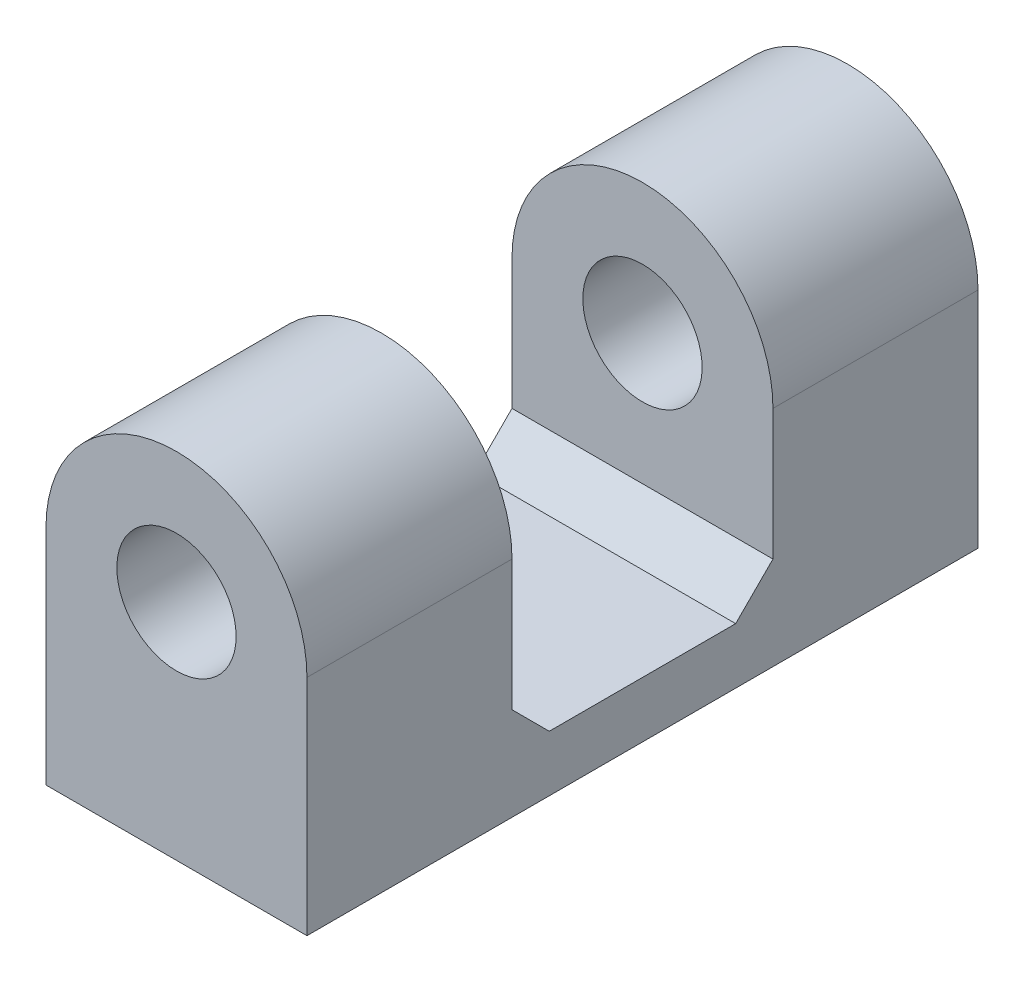
ISO-10303-21;
HEADER;
FILE_DESCRIPTION(('STEP AP214'),'2;1');
FILE_NAME('part.step','',(''),(''),'','','');
FILE_SCHEMA(('AUTOMOTIVE_DESIGN { 1 0 10303 214 1 1 1 1 }'));
ENDSEC;
DATA;
#1=APPLICATION_CONTEXT('core data for automotive mechanical design processes');
#2=APPLICATION_PROTOCOL_DEFINITION('international standard','automotive_design',2000,#1);
#3=PRODUCT_CONTEXT('',#1,'mechanical');
#4=PRODUCT('Part','Part','',(#3));
#5=PRODUCT_RELATED_PRODUCT_CATEGORY('part','',(#4));
#6=PRODUCT_DEFINITION_FORMATION('','',#4);
#7=PRODUCT_DEFINITION_CONTEXT('part definition',#1,'design');
#8=PRODUCT_DEFINITION('design','',#6,#7);
#9=PRODUCT_DEFINITION_SHAPE('','',#8);
#10=(LENGTH_UNIT() NAMED_UNIT(*) SI_UNIT(.MILLI.,.METRE.));
#11=(NAMED_UNIT(*) PLANE_ANGLE_UNIT() SI_UNIT($,.RADIAN.));
#12=(NAMED_UNIT(*) SI_UNIT($,.STERADIAN.) SOLID_ANGLE_UNIT());
#13=UNCERTAINTY_MEASURE_WITH_UNIT(LENGTH_MEASURE(1.E-05),#10,'distance_accuracy_value','');
#14=(GEOMETRIC_REPRESENTATION_CONTEXT(3) GLOBAL_UNCERTAINTY_ASSIGNED_CONTEXT((#13)) GLOBAL_UNIT_ASSIGNED_CONTEXT((#10,
#11,#12)) REPRESENTATION_CONTEXT('',''));
#15=CARTESIAN_POINT('',(0.,0.,0.));
#16=DIRECTION('',(0.,0.,1.));
#17=DIRECTION('',(1.,0.,0.));
#18=AXIS2_PLACEMENT_3D('',#15,#16,#17);
#19=CARTESIAN_POINT('',(0.,0.,18.));
#20=DIRECTION('',(0.,0.,-1.));
#21=DIRECTION('',(-1.,0.,0.));
#22=AXIS2_PLACEMENT_3D('',#19,#20,#21);
#23=CYLINDRICAL_SURFACE('',#22,3.5);
#24=DIRECTION('',(0.,0.,-1.));
#25=VECTOR('',#24,1.);
#26=CARTESIAN_POINT('',(-3.5,0.,18.));
#27=LINE('',#26,#25);
#28=CARTESIAN_POINT('',(-3.5,0.,5.5));
#29=VERTEX_POINT('',#28);
#30=CARTESIAN_POINT('',(-3.5,0.,0.));
#31=VERTEX_POINT('',#30);
#32=EDGE_CURVE('E190',#29,#31,#27,.T.);
#33=ORIENTED_EDGE('',*,*,#32,.F.);
#34=CARTESIAN_POINT('',(0.,0.,5.5));
#35=DIRECTION('',(0.,0.,-1.));
#36=DIRECTION('',(0.,1.,0.));
#37=AXIS2_PLACEMENT_3D('',#34,#35,#36);
#38=CIRCLE('',#37,3.5);
#39=CARTESIAN_POINT('',(3.5,0.,5.5));
#40=VERTEX_POINT('',#39);
#41=EDGE_CURVE('E156',#29,#40,#38,.T.);
#42=ORIENTED_EDGE('',*,*,#41,.T.);
#43=DIRECTION('',(0.,0.,-1.));
#44=VECTOR('',#43,1.);
#45=CARTESIAN_POINT('',(3.5,0.,18.));
#46=LINE('',#45,#44);
#47=CARTESIAN_POINT('',(3.5,0.,0.));
#48=VERTEX_POINT('',#47);
#49=EDGE_CURVE('E194',#40,#48,#46,.T.);
#50=ORIENTED_EDGE('',*,*,#49,.T.);
#51=CARTESIAN_POINT('',(0.,0.,0.));
#52=DIRECTION('',(0.,0.,1.));
#53=DIRECTION('',(1.,0.,0.));
#54=AXIS2_PLACEMENT_3D('',#51,#52,#53);
#55=CIRCLE('',#54,3.5);
#56=EDGE_CURVE('E179',#48,#31,#55,.T.);
#57=ORIENTED_EDGE('',*,*,#56,.T.);
#58=EDGE_LOOP('',(#33,#42,#50,#57));
#59=FACE_BOUND('',#58,.T.);
#60=ADVANCED_FACE('F36',(#59),#23,.T.);
#61=CARTESIAN_POINT('',(0.,0.,18.));
#62=DIRECTION('',(0.,0.,-1.));
#63=DIRECTION('',(-1.,0.,0.));
#64=AXIS2_PLACEMENT_3D('',#61,#62,#63);
#65=CYLINDRICAL_SURFACE('',#64,1.6);
#66=CARTESIAN_POINT('',(0.,0.,5.5));
#67=DIRECTION('',(0.,0.,-1.));
#68=DIRECTION('',(0.,1.,0.));
#69=AXIS2_PLACEMENT_3D('',#66,#67,#68);
#70=CIRCLE('',#69,1.6);
#71=CARTESIAN_POINT('',(0.,1.6,5.5));
#72=VERTEX_POINT('',#71);
#73=EDGE_CURVE('E155',#72,#72,#70,.T.);
#74=ORIENTED_EDGE('',*,*,#73,.F.);
#75=EDGE_LOOP('',(#74));
#76=FACE_BOUND('',#75,.T.);
#77=CARTESIAN_POINT('',(0.,0.,0.));
#78=DIRECTION('',(0.,0.,1.));
#79=DIRECTION('',(1.,0.,0.));
#80=AXIS2_PLACEMENT_3D('',#77,#78,#79);
#81=CIRCLE('',#80,1.6);
#82=CARTESIAN_POINT('',(1.6,0.,0.));
#83=VERTEX_POINT('',#82);
#84=EDGE_CURVE('E159',#83,#83,#81,.T.);
#85=ORIENTED_EDGE('',*,*,#84,.F.);
#86=EDGE_LOOP('',(#85));
#87=FACE_BOUND('',#86,.T.);
#88=ADVANCED_FACE('F267',(#76,#87),#65,.F.);
#89=CARTESIAN_POINT('',(0.,0.,18.));
#90=DIRECTION('',(0.,0.,1.));
#91=DIRECTION('',(1.,0.,0.));
#92=AXIS2_PLACEMENT_3D('',#89,#90,#91);
#93=PLANE('',#92);
#94=DIRECTION('',(0.,1.,0.));
#95=VECTOR('',#94,1.);
#96=CARTESIAN_POINT('',(3.5,-6.,18.));
#97=LINE('',#96,#95);
#98=CARTESIAN_POINT('',(3.5,-6.,18.));
#99=VERTEX_POINT('',#98);
#100=CARTESIAN_POINT('',(3.5,0.,18.));
#101=VERTEX_POINT('',#100);
#102=EDGE_CURVE('E166',#99,#101,#97,.T.);
#103=ORIENTED_EDGE('',*,*,#102,.T.);
#104=CARTESIAN_POINT('',(0.,0.,18.));
#105=DIRECTION('',(0.,0.,1.));
#106=DIRECTION('',(1.,0.,0.));
#107=AXIS2_PLACEMENT_3D('',#104,#105,#106);
#108=CIRCLE('',#107,3.5);
#109=CARTESIAN_POINT('',(-3.5,0.,18.));
#110=VERTEX_POINT('',#109);
#111=EDGE_CURVE('E169',#101,#110,#108,.T.);
#112=ORIENTED_EDGE('',*,*,#111,.T.);
#113=DIRECTION('',(0.,-1.,0.));
#114=VECTOR('',#113,1.);
#115=CARTESIAN_POINT('',(-3.5,-6.,18.));
#116=LINE('',#115,#114);
#117=CARTESIAN_POINT('',(-3.5,-6.,18.));
#118=VERTEX_POINT('',#117);
#119=EDGE_CURVE('E172',#110,#118,#116,.T.);
#120=ORIENTED_EDGE('',*,*,#119,.T.);
#121=DIRECTION('',(1.,0.,0.));
#122=VECTOR('',#121,1.);
#123=CARTESIAN_POINT('',(-3.5,-6.,18.));
#124=LINE('',#123,#122);
#125=EDGE_CURVE('E174',#118,#99,#124,.T.);
#126=ORIENTED_EDGE('',*,*,#125,.T.);
#127=EDGE_LOOP('',(#103,#112,#120,#126));
#128=FACE_BOUND('',#127,.T.);
#129=CARTESIAN_POINT('',(0.,0.,18.));
#130=DIRECTION('',(0.,0.,1.));
#131=DIRECTION('',(1.,0.,0.));
#132=AXIS2_PLACEMENT_3D('',#129,#130,#131);
#133=CIRCLE('',#132,1.6);
#134=CARTESIAN_POINT('',(1.6,0.,18.));
#135=VERTEX_POINT('',#134);
#136=EDGE_CURVE('E160',#135,#135,#133,.T.);
#137=ORIENTED_EDGE('',*,*,#136,.F.);
#138=EDGE_LOOP('',(#137));
#139=FACE_BOUND('',#138,.T.);
#140=ADVANCED_FACE('F253',(#128,#139),#93,.T.);
#141=CARTESIAN_POINT('',(0.,0.,0.));
#142=DIRECTION('',(0.,0.,1.));
#143=DIRECTION('',(1.,0.,0.));
#144=AXIS2_PLACEMENT_3D('',#141,#142,#143);
#145=PLANE('',#144);
#146=DIRECTION('',(0.,1.,0.));
#147=VECTOR('',#146,1.);
#148=CARTESIAN_POINT('',(3.5,-6.,0.));
#149=LINE('',#148,#147);
#150=CARTESIAN_POINT('',(3.5,-6.,0.));
#151=VERTEX_POINT('',#150);
#152=EDGE_CURVE('E163',#151,#48,#149,.T.);
#153=ORIENTED_EDGE('',*,*,#152,.F.);
#154=DIRECTION('',(1.,0.,0.));
#155=VECTOR('',#154,1.);
#156=CARTESIAN_POINT('',(-3.5,-6.,0.));
#157=LINE('',#156,#155);
#158=CARTESIAN_POINT('',(-3.5,-6.,0.));
#159=VERTEX_POINT('',#158);
#160=EDGE_CURVE('E170',#159,#151,#157,.T.);
#161=ORIENTED_EDGE('',*,*,#160,.F.);
#162=DIRECTION('',(0.,-1.,0.));
#163=VECTOR('',#162,1.);
#164=CARTESIAN_POINT('',(-3.5,-6.,0.));
#165=LINE('',#164,#163);
#166=EDGE_CURVE('E182',#31,#159,#165,.T.);
#167=ORIENTED_EDGE('',*,*,#166,.F.);
#168=ORIENTED_EDGE('',*,*,#56,.F.);
#169=EDGE_LOOP('',(#153,#161,#167,#168));
#170=FACE_BOUND('',#169,.T.);
#171=ORIENTED_EDGE('',*,*,#84,.T.);
#172=EDGE_LOOP('',(#171));
#173=FACE_BOUND('',#172,.T.);
#174=ADVANCED_FACE('F249',(#170,#173),#145,.F.);
#175=CARTESIAN_POINT('',(3.5,-6.,18.));
#176=DIRECTION('',(-1.,0.,0.));
#177=DIRECTION('',(0.,-1.,0.));
#178=AXIS2_PLACEMENT_3D('',#175,#176,#177);
#179=PLANE('',#178);
#180=ORIENTED_EDGE('',*,*,#49,.F.);
#181=DIRECTION('',(0.,-1.,0.));
#182=VECTOR('',#181,1.);
#183=CARTESIAN_POINT('',(3.5,6.89928781455862,5.5));
#184=LINE('',#183,#182);
#185=CARTESIAN_POINT('',(3.5,-3.50000000000001,5.5));
#186=VERTEX_POINT('',#185);
#187=EDGE_CURVE('E138',#40,#186,#184,.T.);
#188=ORIENTED_EDGE('',*,*,#187,.T.);
#189=DIRECTION('',(0.,0.707106781186544,-0.707106781186551));
#190=VECTOR('',#189,1.);
#191=CARTESIAN_POINT('',(3.5,-11.,13.));
#192=LINE('',#191,#190);
#193=CARTESIAN_POINT('',(3.5,-4.5,6.5));
#194=VERTEX_POINT('',#193);
#195=EDGE_CURVE('E11',#186,#194,#192,.F.);
#196=ORIENTED_EDGE('',*,*,#195,.T.);
#197=DIRECTION('',(0.,0.,1.));
#198=VECTOR('',#197,1.);
#199=CARTESIAN_POINT('',(3.5,-4.5,5.5));
#200=LINE('',#199,#198);
#201=CARTESIAN_POINT('',(3.5,-4.5,11.5));
#202=VERTEX_POINT('',#201);
#203=EDGE_CURVE('E140',#194,#202,#200,.T.);
#204=ORIENTED_EDGE('',*,*,#203,.T.);
#205=DIRECTION('',(0.,-0.707106781186552,-0.707106781186543));
#206=VECTOR('',#205,1.);
#207=CARTESIAN_POINT('',(3.5,-2.00000000000001,14.));
#208=LINE('',#207,#206);
#209=CARTESIAN_POINT('',(3.5,-3.49999999999999,12.5));
#210=VERTEX_POINT('',#209);
#211=EDGE_CURVE('E213',#202,#210,#208,.F.);
#212=ORIENTED_EDGE('',*,*,#211,.T.);
#213=DIRECTION('',(0.,1.,0.));
#214=VECTOR('',#213,1.);
#215=CARTESIAN_POINT('',(3.5,6.89928781455862,12.5));
#216=LINE('',#215,#214);
#217=CARTESIAN_POINT('',(3.5,0.,12.5));
#218=VERTEX_POINT('',#217);
#219=EDGE_CURVE('E144',#210,#218,#216,.T.);
#220=ORIENTED_EDGE('',*,*,#219,.T.);
#221=EDGE_CURVE('E195',#101,#218,#46,.T.);
#222=ORIENTED_EDGE('',*,*,#221,.F.);
#223=ORIENTED_EDGE('',*,*,#102,.F.);
#224=DIRECTION('',(0.,0.,-1.));
#225=VECTOR('',#224,1.);
#226=CARTESIAN_POINT('',(3.5,-6.,18.));
#227=LINE('',#226,#225);
#228=EDGE_CURVE('E176',#99,#151,#227,.T.);
#229=ORIENTED_EDGE('',*,*,#228,.T.);
#230=ORIENTED_EDGE('',*,*,#152,.T.);
#231=EDGE_LOOP('',(#180,#188,#196,#204,#212,#220,#222,#223,#229,#230));
#232=FACE_BOUND('',#231,.T.);
#233=ADVANCED_FACE('F218',(#232),#179,.F.);
#234=ORIENTED_EDGE('',*,*,#221,.T.);
#235=CARTESIAN_POINT('',(0.,0.,12.5));
#236=DIRECTION('',(0.,0.,1.));
#237=DIRECTION('',(0.,-1.,0.));
#238=AXIS2_PLACEMENT_3D('',#235,#236,#237);
#239=CIRCLE('',#238,3.5);
#240=CARTESIAN_POINT('',(-3.5,0.,12.5));
#241=VERTEX_POINT('',#240);
#242=EDGE_CURVE('E152',#218,#241,#239,.T.);
#243=ORIENTED_EDGE('',*,*,#242,.T.);
#244=EDGE_CURVE('E191',#110,#241,#27,.T.);
#245=ORIENTED_EDGE('',*,*,#244,.F.);
#246=ORIENTED_EDGE('',*,*,#111,.F.);
#247=EDGE_LOOP('',(#234,#243,#245,#246));
#248=FACE_BOUND('',#247,.T.);
#249=ADVANCED_FACE('F257',(#248),#23,.T.);
#250=CARTESIAN_POINT('',(-3.5,-6.,18.));
#251=DIRECTION('',(1.,0.,0.));
#252=DIRECTION('',(0.,1.,0.));
#253=AXIS2_PLACEMENT_3D('',#250,#251,#252);
#254=PLANE('',#253);
#255=DIRECTION('',(0.,0.,1.));
#256=VECTOR('',#255,1.);
#257=CARTESIAN_POINT('',(-3.5,-4.5,5.5));
#258=LINE('',#257,#256);
#259=CARTESIAN_POINT('',(-3.5,-4.5,6.5));
#260=VERTEX_POINT('',#259);
#261=CARTESIAN_POINT('',(-3.5,-4.5,11.5));
#262=VERTEX_POINT('',#261);
#263=EDGE_CURVE('E148',#260,#262,#258,.T.);
#264=ORIENTED_EDGE('',*,*,#263,.F.);
#265=DIRECTION('',(0.,-0.707106781186544,0.707106781186551));
#266=VECTOR('',#265,1.);
#267=CARTESIAN_POINT('',(-3.5,-11.,13.));
#268=LINE('',#267,#266);
#269=CARTESIAN_POINT('',(-3.5,-3.50000000000001,5.5));
#270=VERTEX_POINT('',#269);
#271=EDGE_CURVE('E44',#260,#270,#268,.F.);
#272=ORIENTED_EDGE('',*,*,#271,.T.);
#273=DIRECTION('',(0.,-1.,0.));
#274=VECTOR('',#273,1.);
#275=CARTESIAN_POINT('',(-3.5,6.89928781455862,5.5));
#276=LINE('',#275,#274);
#277=EDGE_CURVE('E137',#29,#270,#276,.T.);
#278=ORIENTED_EDGE('',*,*,#277,.F.);
#279=ORIENTED_EDGE('',*,*,#32,.T.);
#280=ORIENTED_EDGE('',*,*,#166,.T.);
#281=DIRECTION('',(0.,0.,-1.));
#282=VECTOR('',#281,1.);
#283=CARTESIAN_POINT('',(-3.5,-6.,18.));
#284=LINE('',#283,#282);
#285=EDGE_CURVE('E187',#118,#159,#284,.T.);
#286=ORIENTED_EDGE('',*,*,#285,.F.);
#287=ORIENTED_EDGE('',*,*,#119,.F.);
#288=ORIENTED_EDGE('',*,*,#244,.T.);
#289=DIRECTION('',(0.,1.,0.));
#290=VECTOR('',#289,1.);
#291=CARTESIAN_POINT('',(-3.5,6.89928781455862,12.5));
#292=LINE('',#291,#290);
#293=CARTESIAN_POINT('',(-3.5,-3.49999999999999,12.5));
#294=VERTEX_POINT('',#293);
#295=EDGE_CURVE('E141',#294,#241,#292,.T.);
#296=ORIENTED_EDGE('',*,*,#295,.F.);
#297=DIRECTION('',(0.,0.707106781186552,0.707106781186543));
#298=VECTOR('',#297,1.);
#299=CARTESIAN_POINT('',(-3.5,-2.00000000000001,14.));
#300=LINE('',#299,#298);
#301=EDGE_CURVE('E211',#294,#262,#300,.F.);
#302=ORIENTED_EDGE('',*,*,#301,.T.);
#303=EDGE_LOOP('',(#264,#272,#278,#279,#280,#286,#287,#288,#296,#302));
#304=FACE_BOUND('',#303,.T.);
#305=ADVANCED_FACE('F229',(#304),#254,.F.);
#306=CARTESIAN_POINT('',(-3.5,-6.,18.));
#307=DIRECTION('',(0.,1.,0.));
#308=DIRECTION('',(0.,0.,1.));
#309=AXIS2_PLACEMENT_3D('',#306,#307,#308);
#310=PLANE('',#309);
#311=CARTESIAN_POINT('',(0.,-6.,3.));
#312=DIRECTION('',(0.,-1.,0.));
#313=DIRECTION('',(0.,0.,-1.));
#314=AXIS2_PLACEMENT_3D('',#311,#312,#313);
#315=CIRCLE('',#314,1.25);
#316=CARTESIAN_POINT('',(0.,-6.,1.75));
#317=VERTEX_POINT('',#316);
#318=EDGE_CURVE('E127',#317,#317,#315,.T.);
#319=ORIENTED_EDGE('',*,*,#318,.F.);
#320=EDGE_LOOP('',(#319));
#321=FACE_BOUND('',#320,.T.);
#322=CARTESIAN_POINT('',(0.,-6.,15.));
#323=DIRECTION('',(0.,-1.,0.));
#324=DIRECTION('',(0.,0.,-1.));
#325=AXIS2_PLACEMENT_3D('',#322,#323,#324);
#326=CIRCLE('',#325,1.25);
#327=CARTESIAN_POINT('',(0.,-6.,13.75));
#328=VERTEX_POINT('',#327);
#329=EDGE_CURVE('E126',#328,#328,#326,.T.);
#330=ORIENTED_EDGE('',*,*,#329,.F.);
#331=EDGE_LOOP('',(#330));
#332=FACE_BOUND('',#331,.T.);
#333=ORIENTED_EDGE('',*,*,#160,.T.);
#334=ORIENTED_EDGE('',*,*,#228,.F.);
#335=ORIENTED_EDGE('',*,*,#125,.F.);
#336=ORIENTED_EDGE('',*,*,#285,.T.);
#337=EDGE_LOOP('',(#333,#334,#335,#336));
#338=FACE_BOUND('',#337,.T.);
#339=ADVANCED_FACE('F246',(#321,#332,#338),#310,.F.);
#340=CARTESIAN_POINT('',(0.,0.,12.5));
#341=DIRECTION('',(0.,0.,1.));
#342=DIRECTION('',(0.,-1.,0.));
#343=AXIS2_PLACEMENT_3D('',#340,#341,#342);
#344=CIRCLE('',#343,1.6);
#345=CARTESIAN_POINT('',(0.,-1.6,12.5));
#346=VERTEX_POINT('',#345);
#347=EDGE_CURVE('E146',#346,#346,#344,.T.);
#348=ORIENTED_EDGE('',*,*,#347,.F.);
#349=EDGE_LOOP('',(#348));
#350=FACE_BOUND('',#349,.T.);
#351=ORIENTED_EDGE('',*,*,#136,.T.);
#352=EDGE_LOOP('',(#351));
#353=FACE_BOUND('',#352,.T.);
#354=ADVANCED_FACE('F273',(#350,#353),#65,.F.);
#355=CARTESIAN_POINT('',(3.5,6.89928781455862,5.5));
#356=DIRECTION('',(0.,0.,-1.));
#357=DIRECTION('',(0.,1.,0.));
#358=AXIS2_PLACEMENT_3D('',#355,#356,#357);
#359=PLANE('',#358);
#360=ORIENTED_EDGE('',*,*,#73,.T.);
#361=EDGE_LOOP('',(#360));
#362=FACE_BOUND('',#361,.T.);
#363=ORIENTED_EDGE('',*,*,#277,.T.);
#364=DIRECTION('',(1.,0.,0.));
#365=VECTOR('',#364,1.);
#366=CARTESIAN_POINT('',(3.5,-3.50000000000001,5.5));
#367=LINE('',#366,#365);
#368=EDGE_CURVE('E51',#270,#186,#367,.T.);
#369=ORIENTED_EDGE('',*,*,#368,.T.);
#370=ORIENTED_EDGE('',*,*,#187,.F.);
#371=ORIENTED_EDGE('',*,*,#41,.F.);
#372=EDGE_LOOP('',(#363,#369,#370,#371));
#373=FACE_BOUND('',#372,.T.);
#374=ADVANCED_FACE('F235',(#362,#373),#359,.F.);
#375=CARTESIAN_POINT('',(3.5,6.89928781455862,12.5));
#376=DIRECTION('',(0.,0.,1.));
#377=DIRECTION('',(0.,-1.,0.));
#378=AXIS2_PLACEMENT_3D('',#375,#376,#377);
#379=PLANE('',#378);
#380=ORIENTED_EDGE('',*,*,#347,.T.);
#381=EDGE_LOOP('',(#380));
#382=FACE_BOUND('',#381,.T.);
#383=ORIENTED_EDGE('',*,*,#219,.F.);
#384=DIRECTION('',(-1.,0.,0.));
#385=VECTOR('',#384,1.);
#386=CARTESIAN_POINT('',(-3.5,-3.49999999999999,12.5));
#387=LINE('',#386,#385);
#388=EDGE_CURVE('E198',#210,#294,#387,.T.);
#389=ORIENTED_EDGE('',*,*,#388,.T.);
#390=ORIENTED_EDGE('',*,*,#295,.T.);
#391=ORIENTED_EDGE('',*,*,#242,.F.);
#392=EDGE_LOOP('',(#383,#389,#390,#391));
#393=FACE_BOUND('',#392,.T.);
#394=ADVANCED_FACE('F226',(#382,#393),#379,.F.);
#395=CARTESIAN_POINT('',(3.5,-4.5,5.5));
#396=DIRECTION('',(0.,-1.,0.));
#397=DIRECTION('',(1.,0.,0.));
#398=AXIS2_PLACEMENT_3D('',#395,#396,#397);
#399=PLANE('',#398);
#400=ORIENTED_EDGE('',*,*,#263,.T.);
#401=DIRECTION('',(1.,0.,0.));
#402=VECTOR('',#401,1.);
#403=CARTESIAN_POINT('',(3.5,-4.5,11.5));
#404=LINE('',#403,#402);
#405=EDGE_CURVE('E208',#262,#202,#404,.T.);
#406=ORIENTED_EDGE('',*,*,#405,.T.);
#407=ORIENTED_EDGE('',*,*,#203,.F.);
#408=DIRECTION('',(-1.,0.,0.));
#409=VECTOR('',#408,1.);
#410=CARTESIAN_POINT('',(-3.5,-4.5,6.5));
#411=LINE('',#410,#409);
#412=EDGE_CURVE('E205',#194,#260,#411,.T.);
#413=ORIENTED_EDGE('',*,*,#412,.T.);
#414=EDGE_LOOP('',(#400,#406,#407,#413));
#415=FACE_BOUND('',#414,.T.);
#416=ADVANCED_FACE('F231',(#415),#399,.F.);
#417=CARTESIAN_POINT('',(0.,-2.5,15.));
#418=DIRECTION('',(0.,-1.,0.));
#419=DIRECTION('',(0.,0.,-1.));
#420=AXIS2_PLACEMENT_3D('',#417,#418,#419);
#421=CONICAL_SURFACE('',#420,1.25,1.02974425867665);
#422=CARTESIAN_POINT('',(0.,-1.74892422621555,15.));
#423=VERTEX_POINT('',#422);
#424=VERTEX_LOOP('',#423);
#425=FACE_BOUND('',#424,.T.);
#426=CARTESIAN_POINT('',(0.,-2.5,15.));
#427=DIRECTION('',(0.,-1.,0.));
#428=DIRECTION('',(0.,0.,-1.));
#429=AXIS2_PLACEMENT_3D('',#426,#427,#428);
#430=CIRCLE('',#429,1.25);
#431=CARTESIAN_POINT('',(0.,-2.5,13.75));
#432=VERTEX_POINT('',#431);
#433=EDGE_CURVE('E130',#432,#432,#430,.T.);
#434=ORIENTED_EDGE('',*,*,#433,.T.);
#435=EDGE_LOOP('',(#434));
#436=FACE_BOUND('',#435,.T.);
#437=ADVANCED_FACE('F299',(#425,#436),#421,.F.);
#438=CARTESIAN_POINT('',(0.,-6.,15.));
#439=DIRECTION('',(0.,-1.,0.));
#440=DIRECTION('',(0.,0.,-1.));
#441=AXIS2_PLACEMENT_3D('',#438,#439,#440);
#442=CYLINDRICAL_SURFACE('',#441,1.25);
#443=ORIENTED_EDGE('',*,*,#433,.F.);
#444=EDGE_LOOP('',(#443));
#445=FACE_BOUND('',#444,.T.);
#446=ORIENTED_EDGE('',*,*,#329,.T.);
#447=EDGE_LOOP('',(#446));
#448=FACE_BOUND('',#447,.T.);
#449=ADVANCED_FACE('F120',(#445,#448),#442,.F.);
#450=CARTESIAN_POINT('',(0.,-2.5,3.));
#451=DIRECTION('',(0.,-1.,0.));
#452=DIRECTION('',(0.,0.,-1.));
#453=AXIS2_PLACEMENT_3D('',#450,#451,#452);
#454=CONICAL_SURFACE('',#453,1.25,1.02974425867665);
#455=CARTESIAN_POINT('',(0.,-1.74892422621555,3.));
#456=VERTEX_POINT('',#455);
#457=VERTEX_LOOP('',#456);
#458=FACE_BOUND('',#457,.T.);
#459=CARTESIAN_POINT('',(0.,-2.5,3.));
#460=DIRECTION('',(0.,-1.,0.));
#461=DIRECTION('',(0.,0.,-1.));
#462=AXIS2_PLACEMENT_3D('',#459,#460,#461);
#463=CIRCLE('',#462,1.25);
#464=CARTESIAN_POINT('',(0.,-2.5,1.75));
#465=VERTEX_POINT('',#464);
#466=EDGE_CURVE('E124',#465,#465,#463,.T.);
#467=ORIENTED_EDGE('',*,*,#466,.T.);
#468=EDGE_LOOP('',(#467));
#469=FACE_BOUND('',#468,.T.);
#470=ADVANCED_FACE('F116',(#458,#469),#454,.F.);
#471=CARTESIAN_POINT('',(0.,-6.,3.));
#472=DIRECTION('',(0.,-1.,0.));
#473=DIRECTION('',(0.,0.,-1.));
#474=AXIS2_PLACEMENT_3D('',#471,#472,#473);
#475=CYLINDRICAL_SURFACE('',#474,1.25);
#476=ORIENTED_EDGE('',*,*,#466,.F.);
#477=EDGE_LOOP('',(#476));
#478=FACE_BOUND('',#477,.T.);
#479=ORIENTED_EDGE('',*,*,#318,.T.);
#480=EDGE_LOOP('',(#479));
#481=FACE_BOUND('',#480,.T.);
#482=ADVANCED_FACE('F119',(#478,#481),#475,.F.);
#483=CARTESIAN_POINT('',(3.5,-3.49999999999999,12.5));
#484=DIRECTION('',(0.,0.707106781186543,-0.707106781186552));
#485=DIRECTION('',(1.,0.,0.));
#486=AXIS2_PLACEMENT_3D('',#483,#484,#485);
#487=PLANE('',#486);
#488=ORIENTED_EDGE('',*,*,#211,.F.);
#489=ORIENTED_EDGE('',*,*,#405,.F.);
#490=ORIENTED_EDGE('',*,*,#301,.F.);
#491=ORIENTED_EDGE('',*,*,#388,.F.);
#492=EDGE_LOOP('',(#488,#489,#490,#491));
#493=FACE_BOUND('',#492,.T.);
#494=ADVANCED_FACE('F228',(#493),#487,.T.);
#495=CARTESIAN_POINT('',(3.5,-4.5,6.5));
#496=DIRECTION('',(0.,0.707106781186551,0.707106781186544));
#497=DIRECTION('',(1.,0.,0.));
#498=AXIS2_PLACEMENT_3D('',#495,#496,#497);
#499=PLANE('',#498);
#500=ORIENTED_EDGE('',*,*,#195,.F.);
#501=ORIENTED_EDGE('',*,*,#368,.F.);
#502=ORIENTED_EDGE('',*,*,#271,.F.);
#503=ORIENTED_EDGE('',*,*,#412,.F.);
#504=EDGE_LOOP('',(#500,#501,#502,#503));
#505=FACE_BOUND('',#504,.T.);
#506=ADVANCED_FACE('F38',(#505),#499,.T.);
#507=CLOSED_SHELL('',(#60,#88,#140,#174,#233,#249,#305,#339,#354,#374,#394,#416,#437,#449,#470,
#482,#494,#506));
#508=MANIFOLD_SOLID_BREP('B2',#507);
#509=ADVANCED_BREP_SHAPE_REPRESENTATION('',(#18,#508),#14);
#510=SHAPE_DEFINITION_REPRESENTATION(#9,#509);
ENDSEC;
END-ISO-10303-21;
